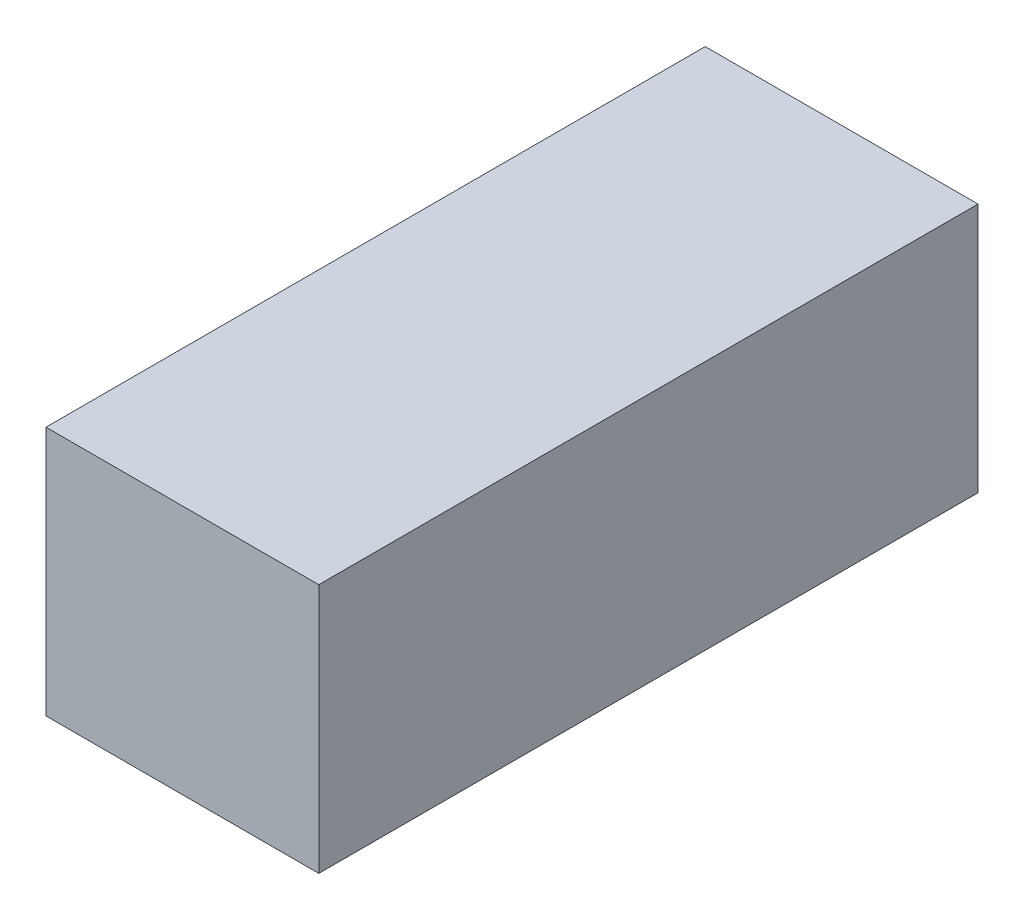
ISO-10303-21;
HEADER;
FILE_DESCRIPTION(('STEP AP214'),'2;1');
FILE_NAME('part.step','',(''),(''),'','','');
FILE_SCHEMA(('AUTOMOTIVE_DESIGN { 1 0 10303 214 1 1 1 1 }'));
ENDSEC;
DATA;
#1=APPLICATION_CONTEXT('core data for automotive mechanical design processes');
#2=APPLICATION_PROTOCOL_DEFINITION('international standard','automotive_design',2000,#1);
#3=PRODUCT_CONTEXT('',#1,'mechanical');
#4=PRODUCT('Part','Part','',(#3));
#5=PRODUCT_RELATED_PRODUCT_CATEGORY('part','',(#4));
#6=PRODUCT_DEFINITION_FORMATION('','',#4);
#7=PRODUCT_DEFINITION_CONTEXT('part definition',#1,'design');
#8=PRODUCT_DEFINITION('design','',#6,#7);
#9=PRODUCT_DEFINITION_SHAPE('','',#8);
#10=(LENGTH_UNIT() NAMED_UNIT(*) SI_UNIT(.MILLI.,.METRE.));
#11=(NAMED_UNIT(*) PLANE_ANGLE_UNIT() SI_UNIT($,.RADIAN.));
#12=(NAMED_UNIT(*) SI_UNIT($,.STERADIAN.) SOLID_ANGLE_UNIT());
#13=UNCERTAINTY_MEASURE_WITH_UNIT(LENGTH_MEASURE(1.E-05),#10,'distance_accuracy_value','');
#14=(GEOMETRIC_REPRESENTATION_CONTEXT(3) GLOBAL_UNCERTAINTY_ASSIGNED_CONTEXT((#13)) GLOBAL_UNIT_ASSIGNED_CONTEXT((#10,
#11,#12)) REPRESENTATION_CONTEXT('',''));
#15=CARTESIAN_POINT('',(0.,0.,0.));
#16=DIRECTION('',(0.,0.,1.));
#17=DIRECTION('',(1.,0.,0.));
#18=AXIS2_PLACEMENT_3D('',#15,#16,#17);
#19=CARTESIAN_POINT('',(6.,-5.5,29.));
#20=DIRECTION('',(-1.,0.,0.));
#21=DIRECTION('',(0.,0.,1.));
#22=AXIS2_PLACEMENT_3D('',#19,#20,#21);
#23=PLANE('',#22);
#24=DIRECTION('',(0.,1.,0.));
#25=VECTOR('',#24,1.);
#26=CARTESIAN_POINT('',(6.,-5.5,0.));
#27=LINE('',#26,#25);
#28=CARTESIAN_POINT('',(6.,-5.5,0.));
#29=VERTEX_POINT('',#28);
#30=CARTESIAN_POINT('',(6.,5.5,0.));
#31=VERTEX_POINT('',#30);
#32=EDGE_CURVE('E96',#29,#31,#27,.T.);
#33=ORIENTED_EDGE('',*,*,#32,.T.);
#34=DIRECTION('',(0.,0.,-1.));
#35=VECTOR('',#34,1.);
#36=CARTESIAN_POINT('',(6.,5.5,29.));
#37=LINE('',#36,#35);
#38=CARTESIAN_POINT('',(6.,5.5,29.));
#39=VERTEX_POINT('',#38);
#40=EDGE_CURVE('E11',#39,#31,#37,.T.);
#41=ORIENTED_EDGE('',*,*,#40,.F.);
#42=DIRECTION('',(0.,1.,0.));
#43=VECTOR('',#42,1.);
#44=CARTESIAN_POINT('',(6.,-5.5,29.));
#45=LINE('',#44,#43);
#46=CARTESIAN_POINT('',(6.,-5.5,29.));
#47=VERTEX_POINT('',#46);
#48=EDGE_CURVE('E84',#47,#39,#45,.T.);
#49=ORIENTED_EDGE('',*,*,#48,.F.);
#50=DIRECTION('',(0.,0.,-1.));
#51=VECTOR('',#50,1.);
#52=CARTESIAN_POINT('',(6.,-5.5,29.));
#53=LINE('',#52,#51);
#54=EDGE_CURVE('E92',#47,#29,#53,.T.);
#55=ORIENTED_EDGE('',*,*,#54,.T.);
#56=EDGE_LOOP('',(#33,#41,#49,#55));
#57=FACE_BOUND('',#56,.T.);
#58=ADVANCED_FACE('F33',(#57),#23,.F.);
#59=CARTESIAN_POINT('',(-6.,5.5,29.));
#60=DIRECTION('',(0.,-1.,0.));
#61=DIRECTION('',(0.,0.,-1.));
#62=AXIS2_PLACEMENT_3D('',#59,#60,#61);
#63=PLANE('',#62);
#64=DIRECTION('',(-1.,0.,0.));
#65=VECTOR('',#64,1.);
#66=CARTESIAN_POINT('',(-6.,5.5,0.));
#67=LINE('',#66,#65);
#68=CARTESIAN_POINT('',(-6.,5.5,0.));
#69=VERTEX_POINT('',#68);
#70=EDGE_CURVE('E88',#31,#69,#67,.T.);
#71=ORIENTED_EDGE('',*,*,#70,.T.);
#72=DIRECTION('',(0.,0.,-1.));
#73=VECTOR('',#72,1.);
#74=CARTESIAN_POINT('',(-6.,5.5,29.));
#75=LINE('',#74,#73);
#76=CARTESIAN_POINT('',(-6.,5.5,29.));
#77=VERTEX_POINT('',#76);
#78=EDGE_CURVE('E41',#77,#69,#75,.T.);
#79=ORIENTED_EDGE('',*,*,#78,.F.);
#80=DIRECTION('',(-1.,0.,0.));
#81=VECTOR('',#80,1.);
#82=CARTESIAN_POINT('',(-6.,5.5,29.));
#83=LINE('',#82,#81);
#84=EDGE_CURVE('E79',#39,#77,#83,.T.);
#85=ORIENTED_EDGE('',*,*,#84,.F.);
#86=ORIENTED_EDGE('',*,*,#40,.T.);
#87=EDGE_LOOP('',(#71,#79,#85,#86));
#88=FACE_BOUND('',#87,.T.);
#89=ADVANCED_FACE('F87',(#88),#63,.F.);
#90=CARTESIAN_POINT('',(-6.,-5.5,29.));
#91=DIRECTION('',(1.,0.,0.));
#92=DIRECTION('',(0.,0.,-1.));
#93=AXIS2_PLACEMENT_3D('',#90,#91,#92);
#94=PLANE('',#93);
#95=DIRECTION('',(0.,-1.,0.));
#96=VECTOR('',#95,1.);
#97=CARTESIAN_POINT('',(-6.,-5.5,0.));
#98=LINE('',#97,#96);
#99=CARTESIAN_POINT('',(-6.,-5.5,0.));
#100=VERTEX_POINT('',#99);
#101=EDGE_CURVE('E66',#69,#100,#98,.T.);
#102=ORIENTED_EDGE('',*,*,#101,.T.);
#103=DIRECTION('',(0.,0.,-1.));
#104=VECTOR('',#103,1.);
#105=CARTESIAN_POINT('',(-6.,-5.5,29.));
#106=LINE('',#105,#104);
#107=CARTESIAN_POINT('',(-6.,-5.5,29.));
#108=VERTEX_POINT('',#107);
#109=EDGE_CURVE('E89',#108,#100,#106,.T.);
#110=ORIENTED_EDGE('',*,*,#109,.F.);
#111=DIRECTION('',(0.,-1.,0.));
#112=VECTOR('',#111,1.);
#113=CARTESIAN_POINT('',(-6.,-5.5,29.));
#114=LINE('',#113,#112);
#115=EDGE_CURVE('E82',#77,#108,#114,.T.);
#116=ORIENTED_EDGE('',*,*,#115,.F.);
#117=ORIENTED_EDGE('',*,*,#78,.T.);
#118=EDGE_LOOP('',(#102,#110,#116,#117));
#119=FACE_BOUND('',#118,.T.);
#120=ADVANCED_FACE('F90',(#119),#94,.F.);
#121=CARTESIAN_POINT('',(-6.,-5.5,29.));
#122=DIRECTION('',(0.,1.,0.));
#123=DIRECTION('',(0.,0.,1.));
#124=AXIS2_PLACEMENT_3D('',#121,#122,#123);
#125=PLANE('',#124);
#126=DIRECTION('',(1.,0.,0.));
#127=VECTOR('',#126,1.);
#128=CARTESIAN_POINT('',(-6.,-5.5,0.));
#129=LINE('',#128,#127);
#130=EDGE_CURVE('E72',#100,#29,#129,.T.);
#131=ORIENTED_EDGE('',*,*,#130,.T.);
#132=ORIENTED_EDGE('',*,*,#54,.F.);
#133=DIRECTION('',(1.,0.,0.));
#134=VECTOR('',#133,1.);
#135=CARTESIAN_POINT('',(-6.,-5.5,29.));
#136=LINE('',#135,#134);
#137=EDGE_CURVE('E49',#108,#47,#136,.T.);
#138=ORIENTED_EDGE('',*,*,#137,.F.);
#139=ORIENTED_EDGE('',*,*,#109,.T.);
#140=EDGE_LOOP('',(#131,#132,#138,#139));
#141=FACE_BOUND('',#140,.T.);
#142=ADVANCED_FACE('F103',(#141),#125,.F.);
#143=CARTESIAN_POINT('',(0.,0.,29.));
#144=DIRECTION('',(0.,0.,-1.));
#145=DIRECTION('',(-1.,0.,0.));
#146=AXIS2_PLACEMENT_3D('',#143,#144,#145);
#147=PLANE('',#146);
#148=ORIENTED_EDGE('',*,*,#48,.T.);
#149=ORIENTED_EDGE('',*,*,#84,.T.);
#150=ORIENTED_EDGE('',*,*,#115,.T.);
#151=ORIENTED_EDGE('',*,*,#137,.T.);
#152=EDGE_LOOP('',(#148,#149,#150,#151));
#153=FACE_BOUND('',#152,.T.);
#154=ADVANCED_FACE('F80',(#153),#147,.F.);
#155=CARTESIAN_POINT('',(0.,0.,0.));
#156=DIRECTION('',(0.,0.,-1.));
#157=DIRECTION('',(-1.,0.,0.));
#158=AXIS2_PLACEMENT_3D('',#155,#156,#157);
#159=PLANE('',#158);
#160=ORIENTED_EDGE('',*,*,#32,.F.);
#161=ORIENTED_EDGE('',*,*,#130,.F.);
#162=ORIENTED_EDGE('',*,*,#101,.F.);
#163=ORIENTED_EDGE('',*,*,#70,.F.);
#164=EDGE_LOOP('',(#160,#161,#162,#163));
#165=FACE_BOUND('',#164,.T.);
#166=ADVANCED_FACE('F106',(#165),#159,.T.);
#167=CLOSED_SHELL('',(#58,#89,#120,#142,#154,#166));
#168=MANIFOLD_SOLID_BREP('B2',#167);
#169=ADVANCED_BREP_SHAPE_REPRESENTATION('',(#18,#168),#14);
#170=SHAPE_DEFINITION_REPRESENTATION(#9,#169);
ENDSEC;
END-ISO-10303-21;
